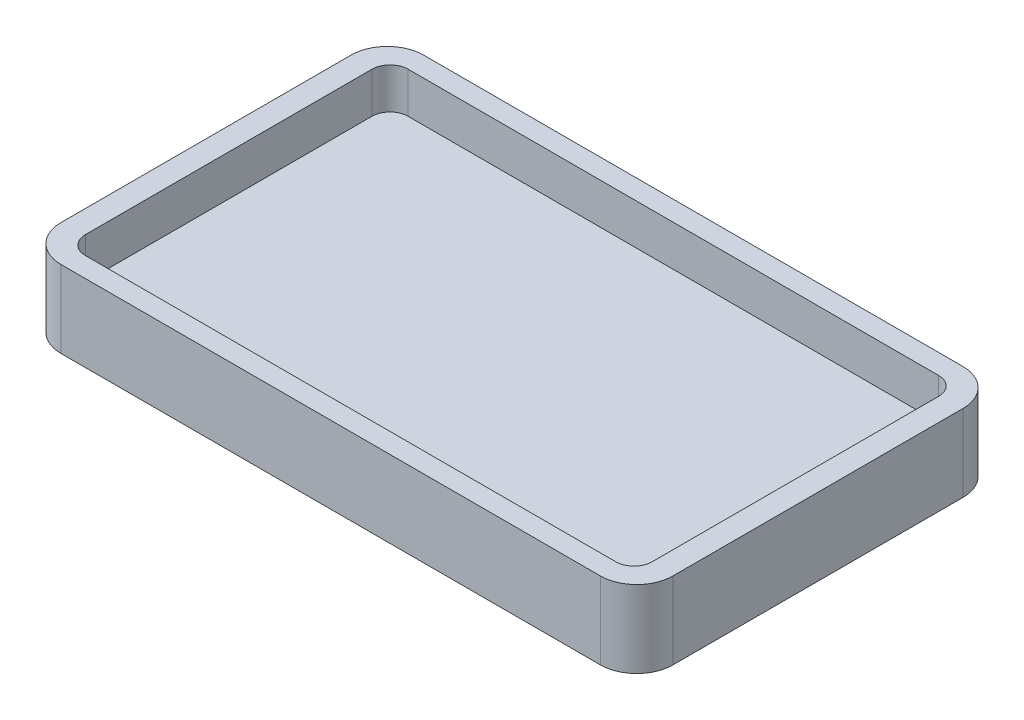
ISO-10303-21;
HEADER;
FILE_DESCRIPTION(('STEP AP214'),'2;1');
FILE_NAME('part.step','',(''),(''),'','','');
FILE_SCHEMA(('AUTOMOTIVE_DESIGN { 1 0 10303 214 1 1 1 1 }'));
ENDSEC;
DATA;
#1=APPLICATION_CONTEXT('core data for automotive mechanical design processes');
#2=APPLICATION_PROTOCOL_DEFINITION('international standard','automotive_design',2000,#1);
#3=PRODUCT_CONTEXT('',#1,'mechanical');
#4=PRODUCT('Part','Part','',(#3));
#5=PRODUCT_RELATED_PRODUCT_CATEGORY('part','',(#4));
#6=PRODUCT_DEFINITION_FORMATION('','',#4);
#7=PRODUCT_DEFINITION_CONTEXT('part definition',#1,'design');
#8=PRODUCT_DEFINITION('design','',#6,#7);
#9=PRODUCT_DEFINITION_SHAPE('','',#8);
#10=(LENGTH_UNIT() NAMED_UNIT(*) SI_UNIT(.MILLI.,.METRE.));
#11=(NAMED_UNIT(*) PLANE_ANGLE_UNIT() SI_UNIT($,.RADIAN.));
#12=(NAMED_UNIT(*) SI_UNIT($,.STERADIAN.) SOLID_ANGLE_UNIT());
#13=UNCERTAINTY_MEASURE_WITH_UNIT(LENGTH_MEASURE(1.E-05),#10,'distance_accuracy_value','');
#14=(GEOMETRIC_REPRESENTATION_CONTEXT(3) GLOBAL_UNCERTAINTY_ASSIGNED_CONTEXT((#13)) GLOBAL_UNIT_ASSIGNED_CONTEXT((#10,
#11,#12)) REPRESENTATION_CONTEXT('',''));
#15=CARTESIAN_POINT('',(0.,0.,0.));
#16=DIRECTION('',(0.,0.,1.));
#17=DIRECTION('',(1.,0.,0.));
#18=AXIS2_PLACEMENT_3D('',#15,#16,#17);
#19=CARTESIAN_POINT('',(-85.725,21.59,-50.8));
#20=DIRECTION('',(1.,0.,0.));
#21=DIRECTION('',(0.,0.,-1.));
#22=AXIS2_PLACEMENT_3D('',#19,#20,#21);
#23=PLANE('',#22);
#24=DIRECTION('',(0.,0.,1.));
#25=VECTOR('',#24,1.);
#26=CARTESIAN_POINT('',(-85.725,21.59,-50.8));
#27=LINE('',#26,#25);
#28=CARTESIAN_POINT('',(-85.725,21.59,-40.64));
#29=VERTEX_POINT('',#28);
#30=CARTESIAN_POINT('',(-85.725,21.59,40.64));
#31=VERTEX_POINT('',#30);
#32=EDGE_CURVE('E190',#29,#31,#27,.T.);
#33=ORIENTED_EDGE('',*,*,#32,.F.);
#34=DIRECTION('',(0.,-1.,0.));
#35=VECTOR('',#34,1.);
#36=CARTESIAN_POINT('',(-85.725,21.59,-40.64));
#37=LINE('',#36,#35);
#38=CARTESIAN_POINT('',(-85.725,0.,-40.64));
#39=VERTEX_POINT('',#38);
#40=EDGE_CURVE('E238',#29,#39,#37,.T.);
#41=ORIENTED_EDGE('',*,*,#40,.T.);
#42=DIRECTION('',(0.,0.,1.));
#43=VECTOR('',#42,1.);
#44=CARTESIAN_POINT('',(-85.725,0.,-50.8));
#45=LINE('',#44,#43);
#46=CARTESIAN_POINT('',(-85.725,0.,40.64));
#47=VERTEX_POINT('',#46);
#48=EDGE_CURVE('E201',#39,#47,#45,.T.);
#49=ORIENTED_EDGE('',*,*,#48,.T.);
#50=DIRECTION('',(0.,-1.,0.));
#51=VECTOR('',#50,1.);
#52=CARTESIAN_POINT('',(-85.725,21.59,40.64));
#53=LINE('',#52,#51);
#54=EDGE_CURVE('E236',#47,#31,#53,.F.);
#55=ORIENTED_EDGE('',*,*,#54,.T.);
#56=EDGE_LOOP('',(#33,#41,#49,#55));
#57=FACE_BOUND('',#56,.T.);
#58=ADVANCED_FACE('F39',(#57),#23,.F.);
#59=CARTESIAN_POINT('',(-85.725,21.59,50.8));
#60=DIRECTION('',(0.,0.,-1.));
#61=DIRECTION('',(-1.,0.,0.));
#62=AXIS2_PLACEMENT_3D('',#59,#60,#61);
#63=PLANE('',#62);
#64=DIRECTION('',(1.,0.,0.));
#65=VECTOR('',#64,1.);
#66=CARTESIAN_POINT('',(-85.725,0.,50.8));
#67=LINE('',#66,#65);
#68=CARTESIAN_POINT('',(-75.565,0.,50.8));
#69=VERTEX_POINT('',#68);
#70=CARTESIAN_POINT('',(75.565,0.,50.8));
#71=VERTEX_POINT('',#70);
#72=EDGE_CURVE('E204',#69,#71,#67,.T.);
#73=ORIENTED_EDGE('',*,*,#72,.T.);
#74=DIRECTION('',(0.,-1.,0.));
#75=VECTOR('',#74,1.);
#76=CARTESIAN_POINT('',(75.565,21.59,50.8));
#77=LINE('',#76,#75);
#78=CARTESIAN_POINT('',(75.565,21.59,50.8));
#79=VERTEX_POINT('',#78);
#80=EDGE_CURVE('E11',#71,#79,#77,.F.);
#81=ORIENTED_EDGE('',*,*,#80,.T.);
#82=DIRECTION('',(1.,0.,0.));
#83=VECTOR('',#82,1.);
#84=CARTESIAN_POINT('',(-85.725,21.59,50.8));
#85=LINE('',#84,#83);
#86=CARTESIAN_POINT('',(-75.565,21.59,50.8));
#87=VERTEX_POINT('',#86);
#88=EDGE_CURVE('E193',#87,#79,#85,.T.);
#89=ORIENTED_EDGE('',*,*,#88,.F.);
#90=DIRECTION('',(0.,-1.,0.));
#91=VECTOR('',#90,1.);
#92=CARTESIAN_POINT('',(-75.565,21.59,50.8));
#93=LINE('',#92,#91);
#94=EDGE_CURVE('E47',#87,#69,#93,.T.);
#95=ORIENTED_EDGE('',*,*,#94,.T.);
#96=EDGE_LOOP('',(#73,#81,#89,#95));
#97=FACE_BOUND('',#96,.T.);
#98=ADVANCED_FACE('F269',(#97),#63,.F.);
#99=CARTESIAN_POINT('',(85.725,21.59,-50.8));
#100=DIRECTION('',(-1.,0.,0.));
#101=DIRECTION('',(0.,0.,1.));
#102=AXIS2_PLACEMENT_3D('',#99,#100,#101);
#103=PLANE('',#102);
#104=DIRECTION('',(0.,0.,-1.));
#105=VECTOR('',#104,1.);
#106=CARTESIAN_POINT('',(85.725,0.,-50.8));
#107=LINE('',#106,#105);
#108=CARTESIAN_POINT('',(85.725,0.,40.64));
#109=VERTEX_POINT('',#108);
#110=CARTESIAN_POINT('',(85.725,0.,-40.64));
#111=VERTEX_POINT('',#110);
#112=EDGE_CURVE('E207',#109,#111,#107,.T.);
#113=ORIENTED_EDGE('',*,*,#112,.T.);
#114=DIRECTION('',(0.,-1.,0.));
#115=VECTOR('',#114,1.);
#116=CARTESIAN_POINT('',(85.725,21.59,-40.64));
#117=LINE('',#116,#115);
#118=CARTESIAN_POINT('',(85.725,21.59,-40.64));
#119=VERTEX_POINT('',#118);
#120=EDGE_CURVE('E54',#111,#119,#117,.F.);
#121=ORIENTED_EDGE('',*,*,#120,.T.);
#122=DIRECTION('',(0.,0.,-1.));
#123=VECTOR('',#122,1.);
#124=CARTESIAN_POINT('',(85.725,21.59,-50.8));
#125=LINE('',#124,#123);
#126=CARTESIAN_POINT('',(85.725,21.59,40.64));
#127=VERTEX_POINT('',#126);
#128=EDGE_CURVE('E196',#127,#119,#125,.T.);
#129=ORIENTED_EDGE('',*,*,#128,.F.);
#130=DIRECTION('',(0.,-1.,0.));
#131=VECTOR('',#130,1.);
#132=CARTESIAN_POINT('',(85.725,21.59,40.64));
#133=LINE('',#132,#131);
#134=EDGE_CURVE('E261',#127,#109,#133,.T.);
#135=ORIENTED_EDGE('',*,*,#134,.T.);
#136=EDGE_LOOP('',(#113,#121,#129,#135));
#137=FACE_BOUND('',#136,.T.);
#138=ADVANCED_FACE('F280',(#137),#103,.F.);
#139=CARTESIAN_POINT('',(-85.725,21.59,-50.8));
#140=DIRECTION('',(0.,0.,1.));
#141=DIRECTION('',(1.,0.,0.));
#142=AXIS2_PLACEMENT_3D('',#139,#140,#141);
#143=PLANE('',#142);
#144=DIRECTION('',(-1.,0.,0.));
#145=VECTOR('',#144,1.);
#146=CARTESIAN_POINT('',(-85.725,0.,-50.8));
#147=LINE('',#146,#145);
#148=CARTESIAN_POINT('',(75.565,0.,-50.8));
#149=VERTEX_POINT('',#148);
#150=CARTESIAN_POINT('',(-75.565,0.,-50.8));
#151=VERTEX_POINT('',#150);
#152=EDGE_CURVE('E194',#149,#151,#147,.T.);
#153=ORIENTED_EDGE('',*,*,#152,.T.);
#154=DIRECTION('',(0.,-1.,0.));
#155=VECTOR('',#154,1.);
#156=CARTESIAN_POINT('',(-75.565,21.59,-50.8));
#157=LINE('',#156,#155);
#158=CARTESIAN_POINT('',(-75.565,21.59,-50.8));
#159=VERTEX_POINT('',#158);
#160=EDGE_CURVE('E252',#151,#159,#157,.F.);
#161=ORIENTED_EDGE('',*,*,#160,.T.);
#162=DIRECTION('',(-1.,0.,0.));
#163=VECTOR('',#162,1.);
#164=CARTESIAN_POINT('',(-85.725,21.59,-50.8));
#165=LINE('',#164,#163);
#166=CARTESIAN_POINT('',(75.565,21.59,-50.8));
#167=VERTEX_POINT('',#166);
#168=EDGE_CURVE('E198',#167,#159,#165,.T.);
#169=ORIENTED_EDGE('',*,*,#168,.F.);
#170=DIRECTION('',(0.,-1.,0.));
#171=VECTOR('',#170,1.);
#172=CARTESIAN_POINT('',(75.565,21.59,-50.8));
#173=LINE('',#172,#171);
#174=EDGE_CURVE('E249',#167,#149,#173,.T.);
#175=ORIENTED_EDGE('',*,*,#174,.T.);
#176=EDGE_LOOP('',(#153,#161,#169,#175));
#177=FACE_BOUND('',#176,.T.);
#178=ADVANCED_FACE('F288',(#177),#143,.F.);
#179=CARTESIAN_POINT('',(0.,21.59,0.));
#180=DIRECTION('',(0.,1.,0.));
#181=DIRECTION('',(0.,0.,1.));
#182=AXIS2_PLACEMENT_3D('',#179,#180,#181);
#183=PLANE('',#182);
#184=DIRECTION('',(0.,0.,1.));
#185=VECTOR('',#184,1.);
#186=CARTESIAN_POINT('',(-79.375,21.59,-45.212));
#187=LINE('',#186,#185);
#188=CARTESIAN_POINT('',(-79.375,21.59,-40.132));
#189=VERTEX_POINT('',#188);
#190=CARTESIAN_POINT('',(-79.375,21.59,40.132));
#191=VERTEX_POINT('',#190);
#192=EDGE_CURVE('E462',#189,#191,#187,.T.);
#193=ORIENTED_EDGE('',*,*,#192,.F.);
#194=CARTESIAN_POINT('',(-74.295,21.59,-40.132));
#195=DIRECTION('',(0.,1.,0.));
#196=DIRECTION('',(0.,0.,1.));
#197=AXIS2_PLACEMENT_3D('',#194,#195,#196);
#198=CIRCLE('',#197,5.08);
#199=CARTESIAN_POINT('',(-74.295,21.59,-45.212));
#200=VERTEX_POINT('',#199);
#201=EDGE_CURVE('E179',#189,#200,#198,.F.);
#202=ORIENTED_EDGE('',*,*,#201,.T.);
#203=DIRECTION('',(-1.,0.,0.));
#204=VECTOR('',#203,1.);
#205=CARTESIAN_POINT('',(-79.375,21.59,-45.212));
#206=LINE('',#205,#204);
#207=CARTESIAN_POINT('',(74.2949999999999,21.59,-45.212));
#208=VERTEX_POINT('',#207);
#209=EDGE_CURVE('E170',#208,#200,#206,.T.);
#210=ORIENTED_EDGE('',*,*,#209,.F.);
#211=CARTESIAN_POINT('',(74.295,21.59,-40.132));
#212=DIRECTION('',(0.,1.,0.));
#213=DIRECTION('',(0.,0.,1.));
#214=AXIS2_PLACEMENT_3D('',#211,#212,#213);
#215=CIRCLE('',#214,5.08);
#216=CARTESIAN_POINT('',(79.375,21.59,-40.132));
#217=VERTEX_POINT('',#216);
#218=EDGE_CURVE('E153',#208,#217,#215,.F.);
#219=ORIENTED_EDGE('',*,*,#218,.T.);
#220=DIRECTION('',(0.,0.,-1.));
#221=VECTOR('',#220,1.);
#222=CARTESIAN_POINT('',(79.375,21.59,-45.212));
#223=LINE('',#222,#221);
#224=CARTESIAN_POINT('',(79.375,21.59,40.132));
#225=VERTEX_POINT('',#224);
#226=EDGE_CURVE('E181',#225,#217,#223,.T.);
#227=ORIENTED_EDGE('',*,*,#226,.F.);
#228=CARTESIAN_POINT('',(74.295,21.59,40.132));
#229=DIRECTION('',(0.,1.,0.));
#230=DIRECTION('',(0.,0.,1.));
#231=AXIS2_PLACEMENT_3D('',#228,#229,#230);
#232=CIRCLE('',#231,5.08);
#233=CARTESIAN_POINT('',(74.2949999999999,21.59,45.212));
#234=VERTEX_POINT('',#233);
#235=EDGE_CURVE('E163',#225,#234,#232,.F.);
#236=ORIENTED_EDGE('',*,*,#235,.T.);
#237=DIRECTION('',(1.,0.,0.));
#238=VECTOR('',#237,1.);
#239=CARTESIAN_POINT('',(-79.375,21.59,45.212));
#240=LINE('',#239,#238);
#241=CARTESIAN_POINT('',(-74.295,21.59,45.212));
#242=VERTEX_POINT('',#241);
#243=EDGE_CURVE('E186',#242,#234,#240,.T.);
#244=ORIENTED_EDGE('',*,*,#243,.F.);
#245=CARTESIAN_POINT('',(-74.295,21.59,40.132));
#246=DIRECTION('',(0.,1.,0.));
#247=DIRECTION('',(0.,0.,1.));
#248=AXIS2_PLACEMENT_3D('',#245,#246,#247);
#249=CIRCLE('',#248,5.08);
#250=EDGE_CURVE('E233',#242,#191,#249,.F.);
#251=ORIENTED_EDGE('',*,*,#250,.T.);
#252=EDGE_LOOP('',(#193,#202,#210,#219,#227,#236,#244,#251));
#253=FACE_BOUND('',#252,.T.);
#254=ORIENTED_EDGE('',*,*,#168,.T.);
#255=CARTESIAN_POINT('',(-75.565,21.59,-40.64));
#256=DIRECTION('',(0.,1.,0.));
#257=DIRECTION('',(0.,0.,1.));
#258=AXIS2_PLACEMENT_3D('',#255,#256,#257);
#259=CIRCLE('',#258,10.16);
#260=EDGE_CURVE('E259',#159,#29,#259,.T.);
#261=ORIENTED_EDGE('',*,*,#260,.T.);
#262=ORIENTED_EDGE('',*,*,#32,.T.);
#263=CARTESIAN_POINT('',(-75.565,21.59,40.64));
#264=DIRECTION('',(0.,1.,0.));
#265=DIRECTION('',(0.,0.,1.));
#266=AXIS2_PLACEMENT_3D('',#263,#264,#265);
#267=CIRCLE('',#266,10.16);
#268=EDGE_CURVE('E254',#31,#87,#267,.T.);
#269=ORIENTED_EDGE('',*,*,#268,.T.);
#270=ORIENTED_EDGE('',*,*,#88,.T.);
#271=CARTESIAN_POINT('',(75.565,21.59,40.64));
#272=DIRECTION('',(0.,1.,0.));
#273=DIRECTION('',(0.,0.,1.));
#274=AXIS2_PLACEMENT_3D('',#271,#272,#273);
#275=CIRCLE('',#274,10.16);
#276=EDGE_CURVE('E61',#79,#127,#275,.T.);
#277=ORIENTED_EDGE('',*,*,#276,.T.);
#278=ORIENTED_EDGE('',*,*,#128,.T.);
#279=CARTESIAN_POINT('',(75.565,21.59,-40.64));
#280=DIRECTION('',(0.,1.,0.));
#281=DIRECTION('',(0.,0.,1.));
#282=AXIS2_PLACEMENT_3D('',#279,#280,#281);
#283=CIRCLE('',#282,10.16);
#284=EDGE_CURVE('E257',#119,#167,#283,.T.);
#285=ORIENTED_EDGE('',*,*,#284,.T.);
#286=EDGE_LOOP('',(#254,#261,#262,#269,#270,#277,#278,#285));
#287=FACE_BOUND('',#286,.T.);
#288=ADVANCED_FACE('F178',(#253,#287),#183,.T.);
#289=CARTESIAN_POINT('',(0.,0.,0.));
#290=DIRECTION('',(0.,1.,0.));
#291=DIRECTION('',(0.,0.,1.));
#292=AXIS2_PLACEMENT_3D('',#289,#290,#291);
#293=PLANE('',#292);
#294=ORIENTED_EDGE('',*,*,#48,.F.);
#295=CARTESIAN_POINT('',(-75.565,0.,-40.64));
#296=DIRECTION('',(0.,1.,0.));
#297=DIRECTION('',(0.,0.,1.));
#298=AXIS2_PLACEMENT_3D('',#295,#296,#297);
#299=CIRCLE('',#298,10.16);
#300=EDGE_CURVE('E247',#39,#151,#299,.F.);
#301=ORIENTED_EDGE('',*,*,#300,.T.);
#302=ORIENTED_EDGE('',*,*,#152,.F.);
#303=CARTESIAN_POINT('',(75.565,0.,-40.64));
#304=DIRECTION('',(0.,1.,0.));
#305=DIRECTION('',(0.,0.,1.));
#306=AXIS2_PLACEMENT_3D('',#303,#304,#305);
#307=CIRCLE('',#306,10.16);
#308=EDGE_CURVE('E245',#149,#111,#307,.F.);
#309=ORIENTED_EDGE('',*,*,#308,.T.);
#310=ORIENTED_EDGE('',*,*,#112,.F.);
#311=CARTESIAN_POINT('',(75.565,0.,40.64));
#312=DIRECTION('',(0.,1.,0.));
#313=DIRECTION('',(0.,0.,1.));
#314=AXIS2_PLACEMENT_3D('',#311,#312,#313);
#315=CIRCLE('',#314,10.16);
#316=EDGE_CURVE('E243',#109,#71,#315,.F.);
#317=ORIENTED_EDGE('',*,*,#316,.T.);
#318=ORIENTED_EDGE('',*,*,#72,.F.);
#319=CARTESIAN_POINT('',(-75.565,0.,40.64));
#320=DIRECTION('',(0.,1.,0.));
#321=DIRECTION('',(0.,0.,1.));
#322=AXIS2_PLACEMENT_3D('',#319,#320,#321);
#323=CIRCLE('',#322,10.16);
#324=EDGE_CURVE('E241',#69,#47,#323,.F.);
#325=ORIENTED_EDGE('',*,*,#324,.T.);
#326=EDGE_LOOP('',(#294,#301,#302,#309,#310,#317,#318,#325));
#327=FACE_BOUND('',#326,.T.);
#328=ADVANCED_FACE('F275',(#327),#293,.F.);
#329=CARTESIAN_POINT('',(-79.375,10.16,-45.212));
#330=DIRECTION('',(-1.,0.,0.));
#331=DIRECTION('',(0.,0.,1.));
#332=AXIS2_PLACEMENT_3D('',#329,#330,#331);
#333=PLANE('',#332);
#334=ORIENTED_EDGE('',*,*,#192,.T.);
#335=DIRECTION('',(0.,1.,0.));
#336=VECTOR('',#335,1.);
#337=CARTESIAN_POINT('',(-79.375,10.16,40.132));
#338=LINE('',#337,#336);
#339=CARTESIAN_POINT('',(-79.375,10.16,40.132));
#340=VERTEX_POINT('',#339);
#341=EDGE_CURVE('E164',#191,#340,#338,.F.);
#342=ORIENTED_EDGE('',*,*,#341,.T.);
#343=DIRECTION('',(0.,0.,1.));
#344=VECTOR('',#343,1.);
#345=CARTESIAN_POINT('',(-79.375,10.16,-45.212));
#346=LINE('',#345,#344);
#347=CARTESIAN_POINT('',(-79.375,10.16,-40.132));
#348=VERTEX_POINT('',#347);
#349=EDGE_CURVE('E180',#348,#340,#346,.T.);
#350=ORIENTED_EDGE('',*,*,#349,.F.);
#351=DIRECTION('',(0.,1.,0.));
#352=VECTOR('',#351,1.);
#353=CARTESIAN_POINT('',(-79.375,21.59,-40.132));
#354=LINE('',#353,#352);
#355=EDGE_CURVE('E228',#348,#189,#354,.T.);
#356=ORIENTED_EDGE('',*,*,#355,.T.);
#357=EDGE_LOOP('',(#334,#342,#350,#356));
#358=FACE_BOUND('',#357,.T.);
#359=ADVANCED_FACE('F401',(#358),#333,.F.);
#360=CARTESIAN_POINT('',(-79.375,10.16,-45.212));
#361=DIRECTION('',(0.,0.,-1.));
#362=DIRECTION('',(-1.,0.,0.));
#363=AXIS2_PLACEMENT_3D('',#360,#361,#362);
#364=PLANE('',#363);
#365=DIRECTION('',(-1.,0.,0.));
#366=VECTOR('',#365,1.);
#367=CARTESIAN_POINT('',(-79.375,10.16,-45.212));
#368=LINE('',#367,#366);
#369=CARTESIAN_POINT('',(74.2949999999999,10.16,-45.212));
#370=VERTEX_POINT('',#369);
#371=CARTESIAN_POINT('',(-74.295,10.16,-45.212));
#372=VERTEX_POINT('',#371);
#373=EDGE_CURVE('E173',#370,#372,#368,.T.);
#374=ORIENTED_EDGE('',*,*,#373,.F.);
#375=DIRECTION('',(0.,1.,0.));
#376=VECTOR('',#375,1.);
#377=CARTESIAN_POINT('',(74.295,21.59,-45.212));
#378=LINE('',#377,#376);
#379=EDGE_CURVE('E157',#370,#208,#378,.T.);
#380=ORIENTED_EDGE('',*,*,#379,.T.);
#381=ORIENTED_EDGE('',*,*,#209,.T.);
#382=DIRECTION('',(0.,1.,0.));
#383=VECTOR('',#382,1.);
#384=CARTESIAN_POINT('',(-74.295,10.16,-45.212));
#385=LINE('',#384,#383);
#386=EDGE_CURVE('E175',#200,#372,#385,.F.);
#387=ORIENTED_EDGE('',*,*,#386,.T.);
#388=EDGE_LOOP('',(#374,#380,#381,#387));
#389=FACE_BOUND('',#388,.T.);
#390=ADVANCED_FACE('F169',(#389),#364,.F.);
#391=CARTESIAN_POINT('',(79.375,10.16,-45.212));
#392=DIRECTION('',(1.,0.,0.));
#393=DIRECTION('',(0.,0.,-1.));
#394=AXIS2_PLACEMENT_3D('',#391,#392,#393);
#395=PLANE('',#394);
#396=ORIENTED_EDGE('',*,*,#226,.T.);
#397=DIRECTION('',(0.,1.,0.));
#398=VECTOR('',#397,1.);
#399=CARTESIAN_POINT('',(79.375,10.16,-40.132));
#400=LINE('',#399,#398);
#401=CARTESIAN_POINT('',(79.375,10.16,-40.132));
#402=VERTEX_POINT('',#401);
#403=EDGE_CURVE('E158',#217,#402,#400,.F.);
#404=ORIENTED_EDGE('',*,*,#403,.T.);
#405=DIRECTION('',(0.,0.,-1.));
#406=VECTOR('',#405,1.);
#407=CARTESIAN_POINT('',(79.375,10.16,-45.212));
#408=LINE('',#407,#406);
#409=CARTESIAN_POINT('',(79.375,10.16,40.132));
#410=VERTEX_POINT('',#409);
#411=EDGE_CURVE('E476',#410,#402,#408,.T.);
#412=ORIENTED_EDGE('',*,*,#411,.F.);
#413=DIRECTION('',(0.,1.,0.));
#414=VECTOR('',#413,1.);
#415=CARTESIAN_POINT('',(79.375,21.59,40.132));
#416=LINE('',#415,#414);
#417=EDGE_CURVE('E174',#410,#225,#416,.T.);
#418=ORIENTED_EDGE('',*,*,#417,.T.);
#419=EDGE_LOOP('',(#396,#404,#412,#418));
#420=FACE_BOUND('',#419,.T.);
#421=ADVANCED_FACE('F384',(#420),#395,.F.);
#422=CARTESIAN_POINT('',(-79.375,10.16,45.212));
#423=DIRECTION('',(0.,0.,1.));
#424=DIRECTION('',(1.,0.,0.));
#425=AXIS2_PLACEMENT_3D('',#422,#423,#424);
#426=PLANE('',#425);
#427=ORIENTED_EDGE('',*,*,#243,.T.);
#428=DIRECTION('',(0.,1.,0.));
#429=VECTOR('',#428,1.);
#430=CARTESIAN_POINT('',(74.295,10.16,45.212));
#431=LINE('',#430,#429);
#432=CARTESIAN_POINT('',(74.2949999999999,10.16,45.212));
#433=VERTEX_POINT('',#432);
#434=EDGE_CURVE('E226',#234,#433,#431,.F.);
#435=ORIENTED_EDGE('',*,*,#434,.T.);
#436=DIRECTION('',(1.,0.,0.));
#437=VECTOR('',#436,1.);
#438=CARTESIAN_POINT('',(-79.375,10.16,45.212));
#439=LINE('',#438,#437);
#440=CARTESIAN_POINT('',(-74.295,10.16,45.212));
#441=VERTEX_POINT('',#440);
#442=EDGE_CURVE('E184',#441,#433,#439,.T.);
#443=ORIENTED_EDGE('',*,*,#442,.F.);
#444=DIRECTION('',(0.,1.,0.));
#445=VECTOR('',#444,1.);
#446=CARTESIAN_POINT('',(-74.295,21.59,45.212));
#447=LINE('',#446,#445);
#448=EDGE_CURVE('E223',#441,#242,#447,.T.);
#449=ORIENTED_EDGE('',*,*,#448,.T.);
#450=EDGE_LOOP('',(#427,#435,#443,#449));
#451=FACE_BOUND('',#450,.T.);
#452=ADVANCED_FACE('F375',(#451),#426,.F.);
#453=CARTESIAN_POINT('',(0.,10.16,0.));
#454=DIRECTION('',(0.,1.,0.));
#455=DIRECTION('',(0.,0.,1.));
#456=AXIS2_PLACEMENT_3D('',#453,#454,#455);
#457=PLANE('',#456);
#458=ORIENTED_EDGE('',*,*,#411,.T.);
#459=CARTESIAN_POINT('',(74.295,10.16,-40.132));
#460=DIRECTION('',(0.,1.,0.));
#461=DIRECTION('',(0.,0.,1.));
#462=AXIS2_PLACEMENT_3D('',#459,#460,#461);
#463=CIRCLE('',#462,5.08);
#464=EDGE_CURVE('E221',#402,#370,#463,.T.);
#465=ORIENTED_EDGE('',*,*,#464,.T.);
#466=ORIENTED_EDGE('',*,*,#373,.T.);
#467=CARTESIAN_POINT('',(-74.295,10.16,-40.132));
#468=DIRECTION('',(0.,1.,0.));
#469=DIRECTION('',(0.,0.,1.));
#470=AXIS2_PLACEMENT_3D('',#467,#468,#469);
#471=CIRCLE('',#470,5.08);
#472=EDGE_CURVE('E215',#372,#348,#471,.T.);
#473=ORIENTED_EDGE('',*,*,#472,.T.);
#474=ORIENTED_EDGE('',*,*,#349,.T.);
#475=CARTESIAN_POINT('',(-74.295,10.16,40.132));
#476=DIRECTION('',(0.,1.,0.));
#477=DIRECTION('',(0.,0.,1.));
#478=AXIS2_PLACEMENT_3D('',#475,#476,#477);
#479=CIRCLE('',#478,5.08);
#480=EDGE_CURVE('E217',#340,#441,#479,.T.);
#481=ORIENTED_EDGE('',*,*,#480,.T.);
#482=ORIENTED_EDGE('',*,*,#442,.T.);
#483=CARTESIAN_POINT('',(74.295,10.16,40.132));
#484=DIRECTION('',(0.,1.,0.));
#485=DIRECTION('',(0.,0.,1.));
#486=AXIS2_PLACEMENT_3D('',#483,#484,#485);
#487=CIRCLE('',#486,5.08);
#488=EDGE_CURVE('E219',#433,#410,#487,.T.);
#489=ORIENTED_EDGE('',*,*,#488,.T.);
#490=EDGE_LOOP('',(#458,#465,#466,#473,#474,#481,#482,#489));
#491=FACE_BOUND('',#490,.T.);
#492=ADVANCED_FACE('F313',(#491),#457,.T.);
#493=CARTESIAN_POINT('',(74.295,10.16,-40.132));
#494=DIRECTION('',(0.,-1.,0.));
#495=DIRECTION('',(0.,0.,-1.));
#496=AXIS2_PLACEMENT_3D('',#493,#494,#495);
#497=CYLINDRICAL_SURFACE('',#496,5.08);
#498=ORIENTED_EDGE('',*,*,#464,.F.);
#499=ORIENTED_EDGE('',*,*,#403,.F.);
#500=ORIENTED_EDGE('',*,*,#218,.F.);
#501=ORIENTED_EDGE('',*,*,#379,.F.);
#502=EDGE_LOOP('',(#498,#499,#500,#501));
#503=FACE_BOUND('',#502,.T.);
#504=ADVANCED_FACE('F156',(#503),#497,.F.);
#505=CARTESIAN_POINT('',(74.295,10.16,40.132));
#506=DIRECTION('',(0.,-1.,0.));
#507=DIRECTION('',(0.,0.,-1.));
#508=AXIS2_PLACEMENT_3D('',#505,#506,#507);
#509=CYLINDRICAL_SURFACE('',#508,5.08);
#510=ORIENTED_EDGE('',*,*,#488,.F.);
#511=ORIENTED_EDGE('',*,*,#434,.F.);
#512=ORIENTED_EDGE('',*,*,#235,.F.);
#513=ORIENTED_EDGE('',*,*,#417,.F.);
#514=EDGE_LOOP('',(#510,#511,#512,#513));
#515=FACE_BOUND('',#514,.T.);
#516=ADVANCED_FACE('F312',(#515),#509,.F.);
#517=CARTESIAN_POINT('',(-74.295,10.16,40.132));
#518=DIRECTION('',(0.,-1.,0.));
#519=DIRECTION('',(0.,0.,-1.));
#520=AXIS2_PLACEMENT_3D('',#517,#518,#519);
#521=CYLINDRICAL_SURFACE('',#520,5.08);
#522=ORIENTED_EDGE('',*,*,#480,.F.);
#523=ORIENTED_EDGE('',*,*,#341,.F.);
#524=ORIENTED_EDGE('',*,*,#250,.F.);
#525=ORIENTED_EDGE('',*,*,#448,.F.);
#526=EDGE_LOOP('',(#522,#523,#524,#525));
#527=FACE_BOUND('',#526,.T.);
#528=ADVANCED_FACE('F316',(#527),#521,.F.);
#529=CARTESIAN_POINT('',(-74.295,10.16,-40.132));
#530=DIRECTION('',(0.,-1.,0.));
#531=DIRECTION('',(0.,0.,-1.));
#532=AXIS2_PLACEMENT_3D('',#529,#530,#531);
#533=CYLINDRICAL_SURFACE('',#532,5.08);
#534=ORIENTED_EDGE('',*,*,#472,.F.);
#535=ORIENTED_EDGE('',*,*,#386,.F.);
#536=ORIENTED_EDGE('',*,*,#201,.F.);
#537=ORIENTED_EDGE('',*,*,#355,.F.);
#538=EDGE_LOOP('',(#534,#535,#536,#537));
#539=FACE_BOUND('',#538,.T.);
#540=ADVANCED_FACE('F320',(#539),#533,.F.);
#541=CARTESIAN_POINT('',(-75.565,21.59,-40.64));
#542=DIRECTION('',(0.,-1.,0.));
#543=DIRECTION('',(0.,0.,-1.));
#544=AXIS2_PLACEMENT_3D('',#541,#542,#543);
#545=CYLINDRICAL_SURFACE('',#544,10.16);
#546=ORIENTED_EDGE('',*,*,#260,.F.);
#547=ORIENTED_EDGE('',*,*,#160,.F.);
#548=ORIENTED_EDGE('',*,*,#300,.F.);
#549=ORIENTED_EDGE('',*,*,#40,.F.);
#550=EDGE_LOOP('',(#546,#547,#548,#549));
#551=FACE_BOUND('',#550,.T.);
#552=ADVANCED_FACE('F293',(#551),#545,.T.);
#553=CARTESIAN_POINT('',(75.565,21.59,-40.64));
#554=DIRECTION('',(0.,-1.,0.));
#555=DIRECTION('',(0.,0.,-1.));
#556=AXIS2_PLACEMENT_3D('',#553,#554,#555);
#557=CYLINDRICAL_SURFACE('',#556,10.16);
#558=ORIENTED_EDGE('',*,*,#284,.F.);
#559=ORIENTED_EDGE('',*,*,#120,.F.);
#560=ORIENTED_EDGE('',*,*,#308,.F.);
#561=ORIENTED_EDGE('',*,*,#174,.F.);
#562=EDGE_LOOP('',(#558,#559,#560,#561));
#563=FACE_BOUND('',#562,.T.);
#564=ADVANCED_FACE('F285',(#563),#557,.T.);
#565=CARTESIAN_POINT('',(75.565,21.59,40.64));
#566=DIRECTION('',(0.,-1.,0.));
#567=DIRECTION('',(0.,0.,-1.));
#568=AXIS2_PLACEMENT_3D('',#565,#566,#567);
#569=CYLINDRICAL_SURFACE('',#568,10.16);
#570=ORIENTED_EDGE('',*,*,#276,.F.);
#571=ORIENTED_EDGE('',*,*,#80,.F.);
#572=ORIENTED_EDGE('',*,*,#316,.F.);
#573=ORIENTED_EDGE('',*,*,#134,.F.);
#574=EDGE_LOOP('',(#570,#571,#572,#573));
#575=FACE_BOUND('',#574,.T.);
#576=ADVANCED_FACE('F279',(#575),#569,.T.);
#577=CARTESIAN_POINT('',(-75.565,21.59,40.64));
#578=DIRECTION('',(0.,-1.,0.));
#579=DIRECTION('',(0.,0.,-1.));
#580=AXIS2_PLACEMENT_3D('',#577,#578,#579);
#581=CYLINDRICAL_SURFACE('',#580,10.16);
#582=ORIENTED_EDGE('',*,*,#268,.F.);
#583=ORIENTED_EDGE('',*,*,#54,.F.);
#584=ORIENTED_EDGE('',*,*,#324,.F.);
#585=ORIENTED_EDGE('',*,*,#94,.F.);
#586=EDGE_LOOP('',(#582,#583,#584,#585));
#587=FACE_BOUND('',#586,.T.);
#588=ADVANCED_FACE('F41',(#587),#581,.T.);
#589=CLOSED_SHELL('',(#58,#98,#138,#178,#288,#328,#359,#390,#421,#452,#492,#504,#516,#528,#540,
#552,#564,#576,#588));
#590=MANIFOLD_SOLID_BREP('B2',#589);
#591=ADVANCED_BREP_SHAPE_REPRESENTATION('',(#18,#590),#14);
#592=SHAPE_DEFINITION_REPRESENTATION(#9,#591);
ENDSEC;
END-ISO-10303-21;
